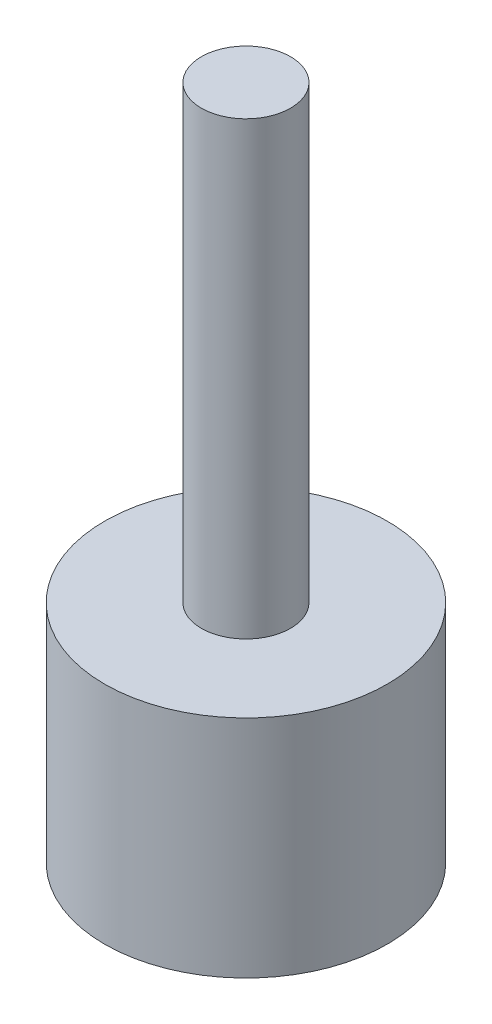
ISO-10303-21;
HEADER;
FILE_DESCRIPTION(('STEP AP214'),'2;1');
FILE_NAME('part.step','',(''),(''),'','','');
FILE_SCHEMA(('AUTOMOTIVE_DESIGN { 1 0 10303 214 1 1 1 1 }'));
ENDSEC;
DATA;
#1=APPLICATION_CONTEXT('core data for automotive mechanical design processes');
#2=APPLICATION_PROTOCOL_DEFINITION('international standard','automotive_design',2000,#1);
#3=PRODUCT_CONTEXT('',#1,'mechanical');
#4=PRODUCT('Part','Part','',(#3));
#5=PRODUCT_RELATED_PRODUCT_CATEGORY('part','',(#4));
#6=PRODUCT_DEFINITION_FORMATION('','',#4);
#7=PRODUCT_DEFINITION_CONTEXT('part definition',#1,'design');
#8=PRODUCT_DEFINITION('design','',#6,#7);
#9=PRODUCT_DEFINITION_SHAPE('','',#8);
#10=(LENGTH_UNIT() NAMED_UNIT(*) SI_UNIT(.MILLI.,.METRE.));
#11=(NAMED_UNIT(*) PLANE_ANGLE_UNIT() SI_UNIT($,.RADIAN.));
#12=(NAMED_UNIT(*) SI_UNIT($,.STERADIAN.) SOLID_ANGLE_UNIT());
#13=UNCERTAINTY_MEASURE_WITH_UNIT(LENGTH_MEASURE(1.E-05),#10,'distance_accuracy_value','');
#14=(GEOMETRIC_REPRESENTATION_CONTEXT(3) GLOBAL_UNCERTAINTY_ASSIGNED_CONTEXT((#13)) GLOBAL_UNIT_ASSIGNED_CONTEXT((#10,
#11,#12)) REPRESENTATION_CONTEXT('',''));
#15=CARTESIAN_POINT('',(0.,0.,0.));
#16=DIRECTION('',(0.,0.,1.));
#17=DIRECTION('',(1.,0.,0.));
#18=AXIS2_PLACEMENT_3D('',#15,#16,#17);
#19=CARTESIAN_POINT('',(0.,0.,0.));
#20=DIRECTION('',(0.,1.,0.));
#21=DIRECTION('',(0.,0.,1.));
#22=AXIS2_PLACEMENT_3D('',#19,#20,#21);
#23=PLANE('',#22);
#24=CARTESIAN_POINT('',(0.,0.,0.));
#25=DIRECTION('',(0.,1.,0.));
#26=DIRECTION('',(0.,0.,1.));
#27=AXIS2_PLACEMENT_3D('',#24,#25,#26);
#28=CIRCLE('',#27,3.13592707309981);
#29=CARTESIAN_POINT('',(0.,0.,3.13592707309981));
#30=VERTEX_POINT('',#29);
#31=EDGE_CURVE('E51',#30,#30,#28,.T.);
#32=ORIENTED_EDGE('',*,*,#31,.F.);
#33=EDGE_LOOP('',(#32));
#34=FACE_BOUND('',#33,.T.);
#35=CARTESIAN_POINT('',(0.,0.,0.));
#36=DIRECTION('',(0.,1.,0.));
#37=DIRECTION('',(0.,0.,1.));
#38=AXIS2_PLACEMENT_3D('',#35,#36,#37);
#39=CIRCLE('',#38,2.55);
#40=CARTESIAN_POINT('',(-1.99576372238424,0.,-1.58727035013416));
#41=VERTEX_POINT('',#40);
#42=CARTESIAN_POINT('',(-1.99576372238423,0.,1.58727035013416));
#43=VERTEX_POINT('',#42);
#44=EDGE_CURVE('E128',#41,#43,#39,.T.);
#45=ORIENTED_EDGE('',*,*,#44,.T.);
#46=DIRECTION('',(-1.,0.,0.));
#47=VECTOR('',#46,1.);
#48=CARTESIAN_POINT('',(0.,0.,1.58727035013416));
#49=LINE('',#48,#47);
#50=CARTESIAN_POINT('',(1.99576372238423,0.,1.58727035013416));
#51=VERTEX_POINT('',#50);
#52=EDGE_CURVE('E65',#51,#43,#49,.T.);
#53=ORIENTED_EDGE('',*,*,#52,.F.);
#54=CARTESIAN_POINT('',(1.99576372238424,0.,-1.58727035013416));
#55=VERTEX_POINT('',#54);
#56=EDGE_CURVE('E124',#51,#55,#39,.T.);
#57=ORIENTED_EDGE('',*,*,#56,.T.);
#58=DIRECTION('',(1.,0.,0.));
#59=VECTOR('',#58,1.);
#60=CARTESIAN_POINT('',(0.,0.,-1.58727035013416));
#61=LINE('',#60,#59);
#62=EDGE_CURVE('E111',#41,#55,#61,.T.);
#63=ORIENTED_EDGE('',*,*,#62,.F.);
#64=EDGE_LOOP('',(#45,#53,#57,#63));
#65=FACE_BOUND('',#64,.T.);
#66=ADVANCED_FACE('F47',(#34,#65),#23,.F.);
#67=CARTESIAN_POINT('',(0.,5.,0.));
#68=DIRECTION('',(0.,-1.,0.));
#69=DIRECTION('',(0.,0.,-1.));
#70=AXIS2_PLACEMENT_3D('',#67,#68,#69);
#71=CYLINDRICAL_SURFACE('',#70,3.13592707309981);
#72=CARTESIAN_POINT('',(0.,5.,0.));
#73=DIRECTION('',(0.,1.,0.));
#74=DIRECTION('',(0.,0.,1.));
#75=AXIS2_PLACEMENT_3D('',#72,#73,#74);
#76=CIRCLE('',#75,3.13592707309981);
#77=CARTESIAN_POINT('',(0.,5.,3.13592707309981));
#78=VERTEX_POINT('',#77);
#79=EDGE_CURVE('E57',#78,#78,#76,.T.);
#80=ORIENTED_EDGE('',*,*,#79,.F.);
#81=EDGE_LOOP('',(#80));
#82=FACE_BOUND('',#81,.T.);
#83=ORIENTED_EDGE('',*,*,#31,.T.);
#84=EDGE_LOOP('',(#83));
#85=FACE_BOUND('',#84,.T.);
#86=ADVANCED_FACE('F49',(#82,#85),#71,.T.);
#87=CARTESIAN_POINT('',(0.,5.,0.));
#88=DIRECTION('',(0.,1.,0.));
#89=DIRECTION('',(0.,0.,1.));
#90=AXIS2_PLACEMENT_3D('',#87,#88,#89);
#91=PLANE('',#90);
#92=CARTESIAN_POINT('',(0.,5.,0.));
#93=DIRECTION('',(0.,1.,0.));
#94=DIRECTION('',(0.,0.,1.));
#95=AXIS2_PLACEMENT_3D('',#92,#93,#94);
#96=CIRCLE('',#95,0.99);
#97=CARTESIAN_POINT('',(0.,5.,0.99));
#98=VERTEX_POINT('',#97);
#99=EDGE_CURVE('E12',#98,#98,#96,.T.);
#100=ORIENTED_EDGE('',*,*,#99,.F.);
#101=EDGE_LOOP('',(#100));
#102=FACE_BOUND('',#101,.T.);
#103=ORIENTED_EDGE('',*,*,#79,.T.);
#104=EDGE_LOOP('',(#103));
#105=FACE_BOUND('',#104,.T.);
#106=ADVANCED_FACE('F163',(#102,#105),#91,.T.);
#107=CARTESIAN_POINT('',(0.,4.,1.58727035013416));
#108=DIRECTION('',(0.,0.,1.));
#109=DIRECTION('',(1.,0.,0.));
#110=AXIS2_PLACEMENT_3D('',#107,#108,#109);
#111=PLANE('',#110);
#112=ORIENTED_EDGE('',*,*,#52,.T.);
#113=DIRECTION('',(0.,-1.,0.));
#114=VECTOR('',#113,1.);
#115=CARTESIAN_POINT('',(-1.99576372238423,4.,1.58727035013416));
#116=LINE('',#115,#114);
#117=CARTESIAN_POINT('',(-1.99576372238423,4.,1.58727035013416));
#118=VERTEX_POINT('',#117);
#119=EDGE_CURVE('E119',#118,#43,#116,.T.);
#120=ORIENTED_EDGE('',*,*,#119,.F.);
#121=DIRECTION('',(-1.,0.,0.));
#122=VECTOR('',#121,1.);
#123=CARTESIAN_POINT('',(0.,4.,1.58727035013416));
#124=LINE('',#123,#122);
#125=CARTESIAN_POINT('',(1.99576372238423,4.,1.58727035013416));
#126=VERTEX_POINT('',#125);
#127=EDGE_CURVE('E107',#126,#118,#124,.T.);
#128=ORIENTED_EDGE('',*,*,#127,.F.);
#129=DIRECTION('',(0.,-1.,0.));
#130=VECTOR('',#129,1.);
#131=CARTESIAN_POINT('',(1.99576372238423,4.,1.58727035013416));
#132=LINE('',#131,#130);
#133=EDGE_CURVE('E95',#126,#51,#132,.T.);
#134=ORIENTED_EDGE('',*,*,#133,.T.);
#135=EDGE_LOOP('',(#112,#120,#128,#134));
#136=FACE_BOUND('',#135,.T.);
#137=ADVANCED_FACE('F165',(#136),#111,.F.);
#138=CARTESIAN_POINT('',(0.,4.,0.));
#139=DIRECTION('',(0.,-1.,0.));
#140=DIRECTION('',(0.,0.,-1.));
#141=AXIS2_PLACEMENT_3D('',#138,#139,#140);
#142=CYLINDRICAL_SURFACE('',#141,2.55);
#143=ORIENTED_EDGE('',*,*,#56,.F.);
#144=ORIENTED_EDGE('',*,*,#133,.F.);
#145=CARTESIAN_POINT('',(0.,4.,0.));
#146=DIRECTION('',(0.,1.,0.));
#147=DIRECTION('',(0.,0.,1.));
#148=AXIS2_PLACEMENT_3D('',#145,#146,#147);
#149=CIRCLE('',#148,2.55);
#150=CARTESIAN_POINT('',(1.99576372238424,4.,-1.58727035013416));
#151=VERTEX_POINT('',#150);
#152=EDGE_CURVE('E97',#126,#151,#149,.T.);
#153=ORIENTED_EDGE('',*,*,#152,.T.);
#154=DIRECTION('',(0.,-1.,0.));
#155=VECTOR('',#154,1.);
#156=CARTESIAN_POINT('',(1.99576372238424,4.,-1.58727035013416));
#157=LINE('',#156,#155);
#158=EDGE_CURVE('E100',#151,#55,#157,.T.);
#159=ORIENTED_EDGE('',*,*,#158,.T.);
#160=EDGE_LOOP('',(#143,#144,#153,#159));
#161=FACE_BOUND('',#160,.T.);
#162=ADVANCED_FACE('F99',(#161),#142,.F.);
#163=CARTESIAN_POINT('',(0.,4.,-1.58727035013416));
#164=DIRECTION('',(0.,0.,-1.));
#165=DIRECTION('',(-1.,0.,0.));
#166=AXIS2_PLACEMENT_3D('',#163,#164,#165);
#167=PLANE('',#166);
#168=ORIENTED_EDGE('',*,*,#62,.T.);
#169=ORIENTED_EDGE('',*,*,#158,.F.);
#170=DIRECTION('',(1.,0.,0.));
#171=VECTOR('',#170,1.);
#172=CARTESIAN_POINT('',(0.,4.,-1.58727035013416));
#173=LINE('',#172,#171);
#174=CARTESIAN_POINT('',(-1.99576372238424,4.,-1.58727035013416));
#175=VERTEX_POINT('',#174);
#176=EDGE_CURVE('E106',#175,#151,#173,.T.);
#177=ORIENTED_EDGE('',*,*,#176,.F.);
#178=DIRECTION('',(0.,-1.,0.));
#179=VECTOR('',#178,1.);
#180=CARTESIAN_POINT('',(-1.99576372238424,4.,-1.58727035013416));
#181=LINE('',#180,#179);
#182=EDGE_CURVE('E88',#175,#41,#181,.T.);
#183=ORIENTED_EDGE('',*,*,#182,.T.);
#184=EDGE_LOOP('',(#168,#169,#177,#183));
#185=FACE_BOUND('',#184,.T.);
#186=ADVANCED_FACE('F109',(#185),#167,.F.);
#187=ORIENTED_EDGE('',*,*,#44,.F.);
#188=ORIENTED_EDGE('',*,*,#182,.F.);
#189=EDGE_CURVE('E73',#175,#118,#149,.T.);
#190=ORIENTED_EDGE('',*,*,#189,.T.);
#191=ORIENTED_EDGE('',*,*,#119,.T.);
#192=EDGE_LOOP('',(#187,#188,#190,#191));
#193=FACE_BOUND('',#192,.T.);
#194=ADVANCED_FACE('F176',(#193),#142,.F.);
#195=CARTESIAN_POINT('',(0.,4.,0.));
#196=DIRECTION('',(0.,1.,0.));
#197=DIRECTION('',(0.,0.,1.));
#198=AXIS2_PLACEMENT_3D('',#195,#196,#197);
#199=PLANE('',#198);
#200=ORIENTED_EDGE('',*,*,#127,.T.);
#201=ORIENTED_EDGE('',*,*,#189,.F.);
#202=ORIENTED_EDGE('',*,*,#176,.T.);
#203=ORIENTED_EDGE('',*,*,#152,.F.);
#204=EDGE_LOOP('',(#200,#201,#202,#203));
#205=FACE_BOUND('',#204,.T.);
#206=ADVANCED_FACE('F115',(#205),#199,.F.);
#207=CARTESIAN_POINT('',(0.,15.,0.));
#208=DIRECTION('',(0.,-1.,0.));
#209=DIRECTION('',(0.,0.,-1.));
#210=AXIS2_PLACEMENT_3D('',#207,#208,#209);
#211=CYLINDRICAL_SURFACE('',#210,0.99);
#212=CARTESIAN_POINT('',(0.,15.,0.));
#213=DIRECTION('',(0.,1.,0.));
#214=DIRECTION('',(0.,0.,1.));
#215=AXIS2_PLACEMENT_3D('',#212,#213,#214);
#216=CIRCLE('',#215,0.99);
#217=CARTESIAN_POINT('',(0.,15.,0.99));
#218=VERTEX_POINT('',#217);
#219=EDGE_CURVE('E125',#218,#218,#216,.T.);
#220=ORIENTED_EDGE('',*,*,#219,.F.);
#221=EDGE_LOOP('',(#220));
#222=FACE_BOUND('',#221,.T.);
#223=ORIENTED_EDGE('',*,*,#99,.T.);
#224=EDGE_LOOP('',(#223));
#225=FACE_BOUND('',#224,.T.);
#226=ADVANCED_FACE('F157',(#222,#225),#211,.T.);
#227=CARTESIAN_POINT('',(0.,15.,0.));
#228=DIRECTION('',(0.,1.,0.));
#229=DIRECTION('',(0.,0.,1.));
#230=AXIS2_PLACEMENT_3D('',#227,#228,#229);
#231=PLANE('',#230);
#232=ORIENTED_EDGE('',*,*,#219,.T.);
#233=EDGE_LOOP('',(#232));
#234=FACE_BOUND('',#233,.T.);
#235=ADVANCED_FACE('F155',(#234),#231,.T.);
#236=CLOSED_SHELL('',(#66,#86,#106,#137,#162,#186,#194,#206,#226,#235));
#237=MANIFOLD_SOLID_BREP('B2',#236);
#238=ADVANCED_BREP_SHAPE_REPRESENTATION('',(#18,#237),#14);
#239=SHAPE_DEFINITION_REPRESENTATION(#9,#238);
ENDSEC;
END-ISO-10303-21;
